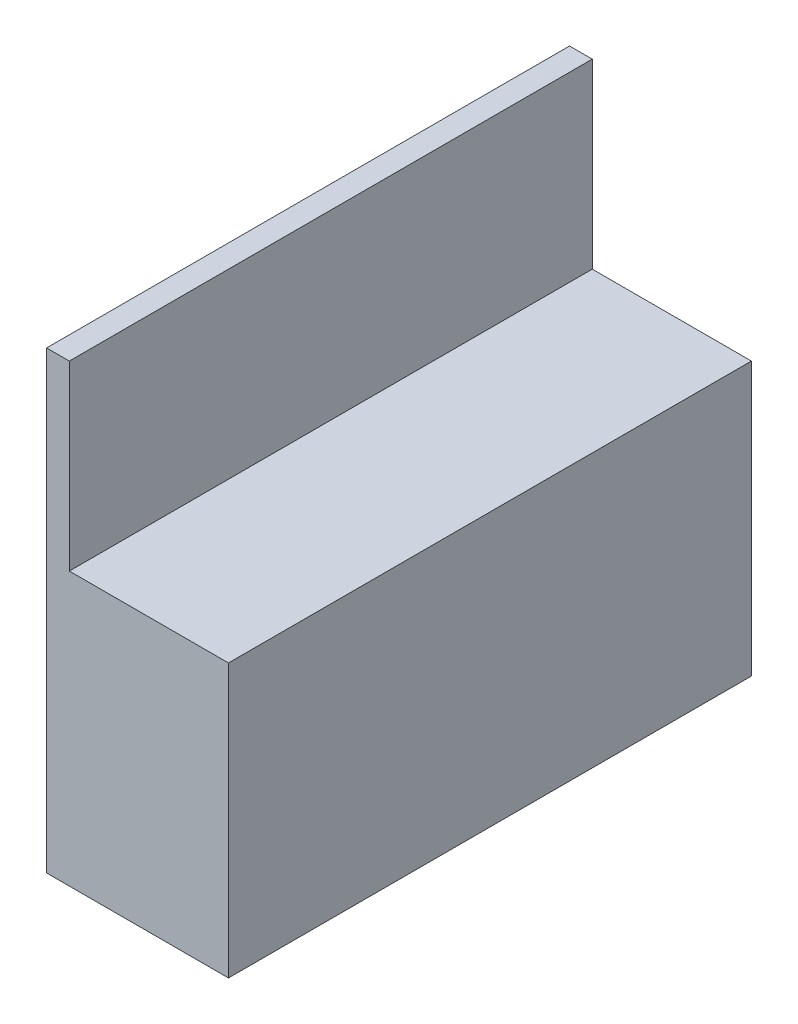
ISO-10303-21;
HEADER;
FILE_DESCRIPTION(('STEP AP214'),'2;1');
FILE_NAME('part.step','',(''),(''),'','','');
FILE_SCHEMA(('AUTOMOTIVE_DESIGN { 1 0 10303 214 1 1 1 1 }'));
ENDSEC;
DATA;
#1=APPLICATION_CONTEXT('core data for automotive mechanical design processes');
#2=APPLICATION_PROTOCOL_DEFINITION('international standard','automotive_design',2000,#1);
#3=PRODUCT_CONTEXT('',#1,'mechanical');
#4=PRODUCT('Part','Part','',(#3));
#5=PRODUCT_RELATED_PRODUCT_CATEGORY('part','',(#4));
#6=PRODUCT_DEFINITION_FORMATION('','',#4);
#7=PRODUCT_DEFINITION_CONTEXT('part definition',#1,'design');
#8=PRODUCT_DEFINITION('design','',#6,#7);
#9=PRODUCT_DEFINITION_SHAPE('','',#8);
#10=(LENGTH_UNIT() NAMED_UNIT(*) SI_UNIT(.MILLI.,.METRE.));
#11=(NAMED_UNIT(*) PLANE_ANGLE_UNIT() SI_UNIT($,.RADIAN.));
#12=(NAMED_UNIT(*) SI_UNIT($,.STERADIAN.) SOLID_ANGLE_UNIT());
#13=UNCERTAINTY_MEASURE_WITH_UNIT(LENGTH_MEASURE(1.E-05),#10,'distance_accuracy_value','');
#14=(GEOMETRIC_REPRESENTATION_CONTEXT(3) GLOBAL_UNCERTAINTY_ASSIGNED_CONTEXT((#13)) GLOBAL_UNIT_ASSIGNED_CONTEXT((#10,
#11,#12)) REPRESENTATION_CONTEXT('',''));
#15=CARTESIAN_POINT('',(0.,0.,0.));
#16=DIRECTION('',(0.,0.,1.));
#17=DIRECTION('',(1.,0.,0.));
#18=AXIS2_PLACEMENT_3D('',#15,#16,#17);
#19=CARTESIAN_POINT('',(0.,0.,115.));
#20=DIRECTION('',(0.,-1.,0.));
#21=DIRECTION('',(0.,0.,-1.));
#22=AXIS2_PLACEMENT_3D('',#19,#20,#21);
#23=PLANE('',#22);
#24=DIRECTION('',(-1.,0.,0.));
#25=VECTOR('',#24,1.);
#26=CARTESIAN_POINT('',(0.,0.,0.));
#27=LINE('',#26,#25);
#28=CARTESIAN_POINT('',(35.,0.,0.));
#29=VERTEX_POINT('',#28);
#30=CARTESIAN_POINT('',(0.,0.,0.));
#31=VERTEX_POINT('',#30);
#32=EDGE_CURVE('E128',#29,#31,#27,.T.);
#33=ORIENTED_EDGE('',*,*,#32,.T.);
#34=DIRECTION('',(0.,0.,-1.));
#35=VECTOR('',#34,1.);
#36=CARTESIAN_POINT('',(0.,0.,115.));
#37=LINE('',#36,#35);
#38=CARTESIAN_POINT('',(0.,0.,115.));
#39=VERTEX_POINT('',#38);
#40=EDGE_CURVE('E11',#39,#31,#37,.T.);
#41=ORIENTED_EDGE('',*,*,#40,.F.);
#42=DIRECTION('',(-1.,0.,0.));
#43=VECTOR('',#42,1.);
#44=CARTESIAN_POINT('',(0.,0.,115.));
#45=LINE('',#44,#43);
#46=CARTESIAN_POINT('',(35.,0.,115.));
#47=VERTEX_POINT('',#46);
#48=EDGE_CURVE('E144',#47,#39,#45,.T.);
#49=ORIENTED_EDGE('',*,*,#48,.F.);
#50=DIRECTION('',(0.,0.,-1.));
#51=VECTOR('',#50,1.);
#52=CARTESIAN_POINT('',(35.,0.,115.));
#53=LINE('',#52,#51);
#54=EDGE_CURVE('E124',#47,#29,#53,.T.);
#55=ORIENTED_EDGE('',*,*,#54,.T.);
#56=EDGE_LOOP('',(#33,#41,#49,#55));
#57=FACE_BOUND('',#56,.T.);
#58=ADVANCED_FACE('F39',(#57),#23,.F.);
#59=CARTESIAN_POINT('',(0.,0.,115.));
#60=DIRECTION('',(-1.,0.,0.));
#61=DIRECTION('',(0.,0.,1.));
#62=AXIS2_PLACEMENT_3D('',#59,#60,#61);
#63=PLANE('',#62);
#64=DIRECTION('',(0.,1.,0.));
#65=VECTOR('',#64,1.);
#66=CARTESIAN_POINT('',(0.,0.,0.));
#67=LINE('',#66,#65);
#68=CARTESIAN_POINT('',(0.,40.,0.));
#69=VERTEX_POINT('',#68);
#70=EDGE_CURVE('E132',#31,#69,#67,.T.);
#71=ORIENTED_EDGE('',*,*,#70,.T.);
#72=DIRECTION('',(0.,0.,-1.));
#73=VECTOR('',#72,1.);
#74=CARTESIAN_POINT('',(0.,40.,115.));
#75=LINE('',#74,#73);
#76=CARTESIAN_POINT('',(0.,40.,115.));
#77=VERTEX_POINT('',#76);
#78=EDGE_CURVE('E48',#77,#69,#75,.T.);
#79=ORIENTED_EDGE('',*,*,#78,.F.);
#80=DIRECTION('',(0.,1.,0.));
#81=VECTOR('',#80,1.);
#82=CARTESIAN_POINT('',(0.,0.,115.));
#83=LINE('',#82,#81);
#84=EDGE_CURVE('E93',#39,#77,#83,.T.);
#85=ORIENTED_EDGE('',*,*,#84,.F.);
#86=ORIENTED_EDGE('',*,*,#40,.T.);
#87=EDGE_LOOP('',(#71,#79,#85,#86));
#88=FACE_BOUND('',#87,.T.);
#89=ADVANCED_FACE('F172',(#88),#63,.F.);
#90=CARTESIAN_POINT('',(0.,40.,115.));
#91=DIRECTION('',(0.,-1.,0.));
#92=DIRECTION('',(0.,0.,-1.));
#93=AXIS2_PLACEMENT_3D('',#90,#91,#92);
#94=PLANE('',#93);
#95=DIRECTION('',(-1.,0.,0.));
#96=VECTOR('',#95,1.);
#97=CARTESIAN_POINT('',(0.,40.,0.));
#98=LINE('',#97,#96);
#99=CARTESIAN_POINT('',(-5.,40.,0.));
#100=VERTEX_POINT('',#99);
#101=EDGE_CURVE('E135',#69,#100,#98,.T.);
#102=ORIENTED_EDGE('',*,*,#101,.T.);
#103=DIRECTION('',(0.,0.,-1.));
#104=VECTOR('',#103,1.);
#105=CARTESIAN_POINT('',(-5.,40.,115.));
#106=LINE('',#105,#104);
#107=CARTESIAN_POINT('',(-5.,40.,115.));
#108=VERTEX_POINT('',#107);
#109=EDGE_CURVE('E117',#108,#100,#106,.T.);
#110=ORIENTED_EDGE('',*,*,#109,.F.);
#111=DIRECTION('',(-1.,0.,0.));
#112=VECTOR('',#111,1.);
#113=CARTESIAN_POINT('',(0.,40.,115.));
#114=LINE('',#113,#112);
#115=EDGE_CURVE('E106',#77,#108,#114,.T.);
#116=ORIENTED_EDGE('',*,*,#115,.F.);
#117=ORIENTED_EDGE('',*,*,#78,.T.);
#118=EDGE_LOOP('',(#102,#110,#116,#117));
#119=FACE_BOUND('',#118,.T.);
#120=ADVANCED_FACE('F154',(#119),#94,.F.);
#121=CARTESIAN_POINT('',(-5.,40.,115.));
#122=DIRECTION('',(1.,0.,0.));
#123=DIRECTION('',(0.,1.,0.));
#124=AXIS2_PLACEMENT_3D('',#121,#122,#123);
#125=PLANE('',#124);
#126=DIRECTION('',(0.,-1.,0.));
#127=VECTOR('',#126,1.);
#128=CARTESIAN_POINT('',(-5.,40.,0.));
#129=LINE('',#128,#127);
#130=CARTESIAN_POINT('',(-4.99999999999999,-60.,0.));
#131=VERTEX_POINT('',#130);
#132=EDGE_CURVE('E115',#100,#131,#129,.T.);
#133=ORIENTED_EDGE('',*,*,#132,.T.);
#134=DIRECTION('',(0.,0.,-1.));
#135=VECTOR('',#134,1.);
#136=CARTESIAN_POINT('',(-4.99999999999999,-60.,115.));
#137=LINE('',#136,#135);
#138=CARTESIAN_POINT('',(-4.99999999999999,-60.,115.));
#139=VERTEX_POINT('',#138);
#140=EDGE_CURVE('E112',#139,#131,#137,.T.);
#141=ORIENTED_EDGE('',*,*,#140,.F.);
#142=DIRECTION('',(0.,-1.,0.));
#143=VECTOR('',#142,1.);
#144=CARTESIAN_POINT('',(-5.,40.,115.));
#145=LINE('',#144,#143);
#146=EDGE_CURVE('E100',#108,#139,#145,.T.);
#147=ORIENTED_EDGE('',*,*,#146,.F.);
#148=ORIENTED_EDGE('',*,*,#109,.T.);
#149=EDGE_LOOP('',(#133,#141,#147,#148));
#150=FACE_BOUND('',#149,.T.);
#151=ADVANCED_FACE('F113',(#150),#125,.F.);
#152=CARTESIAN_POINT('',(-4.99999999999999,-60.,115.));
#153=DIRECTION('',(0.,1.,0.));
#154=DIRECTION('',(-1.,0.,0.));
#155=AXIS2_PLACEMENT_3D('',#152,#153,#154);
#156=PLANE('',#155);
#157=DIRECTION('',(1.,0.,0.));
#158=VECTOR('',#157,1.);
#159=CARTESIAN_POINT('',(-4.99999999999999,-60.,0.));
#160=LINE('',#159,#158);
#161=CARTESIAN_POINT('',(35.,-60.,0.));
#162=VERTEX_POINT('',#161);
#163=EDGE_CURVE('E79',#131,#162,#160,.T.);
#164=ORIENTED_EDGE('',*,*,#163,.T.);
#165=DIRECTION('',(0.,0.,-1.));
#166=VECTOR('',#165,1.);
#167=CARTESIAN_POINT('',(35.,-60.,115.));
#168=LINE('',#167,#166);
#169=CARTESIAN_POINT('',(35.,-60.,115.));
#170=VERTEX_POINT('',#169);
#171=EDGE_CURVE('E118',#170,#162,#168,.T.);
#172=ORIENTED_EDGE('',*,*,#171,.F.);
#173=DIRECTION('',(1.,0.,0.));
#174=VECTOR('',#173,1.);
#175=CARTESIAN_POINT('',(-4.99999999999999,-60.,115.));
#176=LINE('',#175,#174);
#177=EDGE_CURVE('E104',#139,#170,#176,.T.);
#178=ORIENTED_EDGE('',*,*,#177,.F.);
#179=ORIENTED_EDGE('',*,*,#140,.T.);
#180=EDGE_LOOP('',(#164,#172,#178,#179));
#181=FACE_BOUND('',#180,.T.);
#182=ADVANCED_FACE('F120',(#181),#156,.F.);
#183=CARTESIAN_POINT('',(35.,-60.,115.));
#184=DIRECTION('',(-1.,0.,0.));
#185=DIRECTION('',(0.,0.,1.));
#186=AXIS2_PLACEMENT_3D('',#183,#184,#185);
#187=PLANE('',#186);
#188=DIRECTION('',(0.,1.,0.));
#189=VECTOR('',#188,1.);
#190=CARTESIAN_POINT('',(35.,-60.,0.));
#191=LINE('',#190,#189);
#192=EDGE_CURVE('E85',#162,#29,#191,.T.);
#193=ORIENTED_EDGE('',*,*,#192,.T.);
#194=ORIENTED_EDGE('',*,*,#54,.F.);
#195=DIRECTION('',(0.,1.,0.));
#196=VECTOR('',#195,1.);
#197=CARTESIAN_POINT('',(35.,-60.,115.));
#198=LINE('',#197,#196);
#199=EDGE_CURVE('E56',#170,#47,#198,.T.);
#200=ORIENTED_EDGE('',*,*,#199,.F.);
#201=ORIENTED_EDGE('',*,*,#171,.T.);
#202=EDGE_LOOP('',(#193,#194,#200,#201));
#203=FACE_BOUND('',#202,.T.);
#204=ADVANCED_FACE('F161',(#203),#187,.F.);
#205=CARTESIAN_POINT('',(0.,0.,115.));
#206=DIRECTION('',(0.,0.,1.));
#207=DIRECTION('',(1.,0.,0.));
#208=AXIS2_PLACEMENT_3D('',#205,#206,#207);
#209=PLANE('',#208);
#210=ORIENTED_EDGE('',*,*,#48,.T.);
#211=ORIENTED_EDGE('',*,*,#84,.T.);
#212=ORIENTED_EDGE('',*,*,#115,.T.);
#213=ORIENTED_EDGE('',*,*,#146,.T.);
#214=ORIENTED_EDGE('',*,*,#177,.T.);
#215=ORIENTED_EDGE('',*,*,#199,.T.);
#216=EDGE_LOOP('',(#210,#211,#212,#213,#214,#215));
#217=FACE_BOUND('',#216,.T.);
#218=ADVANCED_FACE('F102',(#217),#209,.T.);
#219=CARTESIAN_POINT('',(0.,0.,0.));
#220=DIRECTION('',(0.,0.,1.));
#221=DIRECTION('',(1.,0.,0.));
#222=AXIS2_PLACEMENT_3D('',#219,#220,#221);
#223=PLANE('',#222);
#224=ORIENTED_EDGE('',*,*,#32,.F.);
#225=ORIENTED_EDGE('',*,*,#192,.F.);
#226=ORIENTED_EDGE('',*,*,#163,.F.);
#227=ORIENTED_EDGE('',*,*,#132,.F.);
#228=ORIENTED_EDGE('',*,*,#101,.F.);
#229=ORIENTED_EDGE('',*,*,#70,.F.);
#230=EDGE_LOOP('',(#224,#225,#226,#227,#228,#229));
#231=FACE_BOUND('',#230,.T.);
#232=ADVANCED_FACE('F157',(#231),#223,.F.);
#233=CLOSED_SHELL('',(#58,#89,#120,#151,#182,#204,#218,#232));
#234=MANIFOLD_SOLID_BREP('B2',#233);
#235=ADVANCED_BREP_SHAPE_REPRESENTATION('',(#18,#234),#14);
#236=SHAPE_DEFINITION_REPRESENTATION(#9,#235);
ENDSEC;
END-ISO-10303-21;
